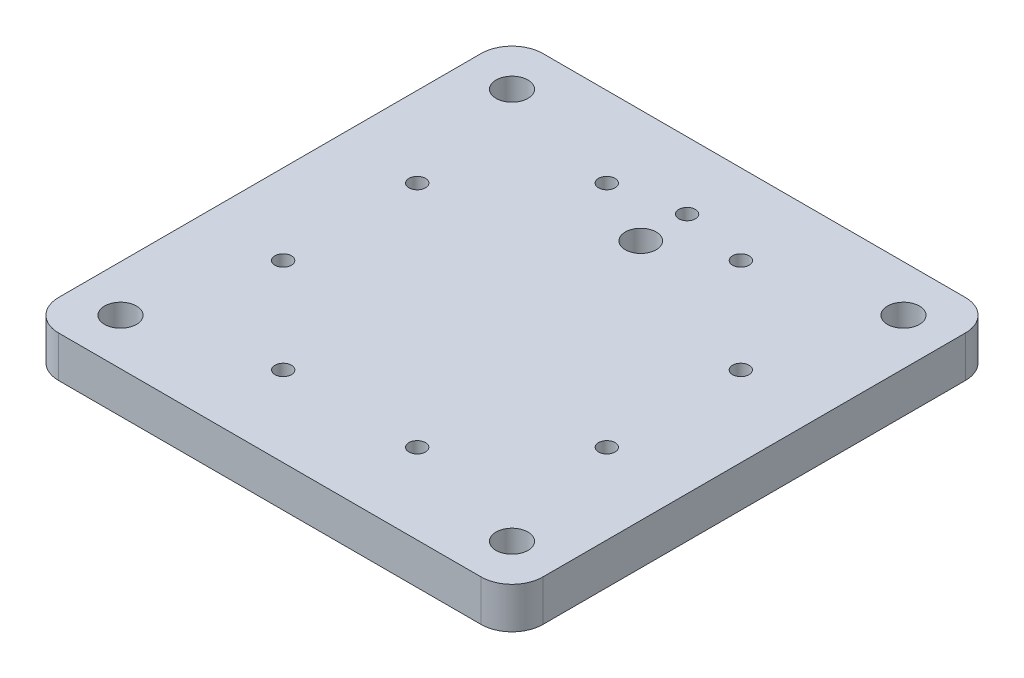
ISO-10303-21;
HEADER;
FILE_DESCRIPTION(('STEP AP214'),'2;1');
FILE_NAME('part.step','',(''),(''),'','','');
FILE_SCHEMA(('AUTOMOTIVE_DESIGN { 1 0 10303 214 1 1 1 1 }'));
ENDSEC;
DATA;
#1=APPLICATION_CONTEXT('core data for automotive mechanical design processes');
#2=APPLICATION_PROTOCOL_DEFINITION('international standard','automotive_design',2000,#1);
#3=PRODUCT_CONTEXT('',#1,'mechanical');
#4=PRODUCT('Part','Part','',(#3));
#5=PRODUCT_RELATED_PRODUCT_CATEGORY('part','',(#4));
#6=PRODUCT_DEFINITION_FORMATION('','',#4);
#7=PRODUCT_DEFINITION_CONTEXT('part definition',#1,'design');
#8=PRODUCT_DEFINITION('design','',#6,#7);
#9=PRODUCT_DEFINITION_SHAPE('','',#8);
#10=(LENGTH_UNIT() NAMED_UNIT(*) SI_UNIT(.MILLI.,.METRE.));
#11=(NAMED_UNIT(*) PLANE_ANGLE_UNIT() SI_UNIT($,.RADIAN.));
#12=(NAMED_UNIT(*) SI_UNIT($,.STERADIAN.) SOLID_ANGLE_UNIT());
#13=UNCERTAINTY_MEASURE_WITH_UNIT(LENGTH_MEASURE(1.E-05),#10,'distance_accuracy_value','');
#14=(GEOMETRIC_REPRESENTATION_CONTEXT(3) GLOBAL_UNCERTAINTY_ASSIGNED_CONTEXT((#13)) GLOBAL_UNIT_ASSIGNED_CONTEXT((#10,
#11,#12)) REPRESENTATION_CONTEXT('',''));
#15=CARTESIAN_POINT('',(0.,0.,0.));
#16=DIRECTION('',(0.,0.,1.));
#17=DIRECTION('',(1.,0.,0.));
#18=AXIS2_PLACEMENT_3D('',#15,#16,#17);
#19=CARTESIAN_POINT('',(-13.0112367004131,8.,-31.4119041053837));
#20=DIRECTION('',(0.,-1.,0.));
#21=DIRECTION('',(0.,0.,-1.));
#22=AXIS2_PLACEMENT_3D('',#19,#20,#21);
#23=CYLINDRICAL_SURFACE('',#22,1.6);
#24=CARTESIAN_POINT('',(-13.0112367004131,8.,-31.4119041053837));
#25=DIRECTION('',(0.,1.,0.));
#26=DIRECTION('',(0.,0.,1.));
#27=AXIS2_PLACEMENT_3D('',#24,#25,#26);
#28=CIRCLE('',#27,1.6);
#29=CARTESIAN_POINT('',(-13.0112367004131,8.,-29.8119041053837));
#30=VERTEX_POINT('',#29);
#31=EDGE_CURVE('E293',#30,#30,#28,.T.);
#32=ORIENTED_EDGE('',*,*,#31,.T.);
#33=EDGE_LOOP('',(#32));
#34=FACE_BOUND('',#33,.T.);
#35=CARTESIAN_POINT('',(-13.0112367004131,3.5,-31.4119041053837));
#36=DIRECTION('',(0.,-1.,0.));
#37=DIRECTION('',(0.,0.,-1.));
#38=AXIS2_PLACEMENT_3D('',#35,#36,#37);
#39=CIRCLE('',#38,1.6);
#40=CARTESIAN_POINT('',(-13.0112367004131,3.5,-33.0119041053837));
#41=VERTEX_POINT('',#40);
#42=EDGE_CURVE('E43',#41,#41,#39,.T.);
#43=ORIENTED_EDGE('',*,*,#42,.T.);
#44=EDGE_LOOP('',(#43));
#45=FACE_BOUND('',#44,.T.);
#46=ADVANCED_FACE('F39',(#34,#45),#23,.F.);
#47=CARTESIAN_POINT('',(13.0112367004135,8.,-31.411904105385));
#48=DIRECTION('',(0.,-1.,0.));
#49=DIRECTION('',(0.,0.,-1.));
#50=AXIS2_PLACEMENT_3D('',#47,#48,#49);
#51=CYLINDRICAL_SURFACE('',#50,1.6);
#52=CARTESIAN_POINT('',(13.0112367004135,8.,-31.411904105385));
#53=DIRECTION('',(0.,1.,0.));
#54=DIRECTION('',(0.,0.,1.));
#55=AXIS2_PLACEMENT_3D('',#52,#53,#54);
#56=CIRCLE('',#55,1.6);
#57=CARTESIAN_POINT('',(13.0112367004135,8.,-29.811904105385));
#58=VERTEX_POINT('',#57);
#59=EDGE_CURVE('E284',#58,#58,#56,.T.);
#60=ORIENTED_EDGE('',*,*,#59,.T.);
#61=EDGE_LOOP('',(#60));
#62=FACE_BOUND('',#61,.T.);
#63=CARTESIAN_POINT('',(13.0112367004135,3.5,-31.411904105385));
#64=DIRECTION('',(0.,-1.,0.));
#65=DIRECTION('',(0.,0.,-1.));
#66=AXIS2_PLACEMENT_3D('',#63,#64,#65);
#67=CIRCLE('',#66,1.6);
#68=CARTESIAN_POINT('',(13.0112367004135,3.5,-33.011904105385));
#69=VERTEX_POINT('',#68);
#70=EDGE_CURVE('E207',#69,#69,#67,.T.);
#71=ORIENTED_EDGE('',*,*,#70,.T.);
#72=EDGE_LOOP('',(#71));
#73=FACE_BOUND('',#72,.T.);
#74=ADVANCED_FACE('F335',(#62,#73),#51,.F.);
#75=CARTESIAN_POINT('',(31.4119041053854,8.,-13.0112367004148));
#76=DIRECTION('',(0.,-1.,0.));
#77=DIRECTION('',(0.,0.,-1.));
#78=AXIS2_PLACEMENT_3D('',#75,#76,#77);
#79=CYLINDRICAL_SURFACE('',#78,1.6);
#80=CARTESIAN_POINT('',(31.4119041053854,8.,-13.0112367004148));
#81=DIRECTION('',(0.,1.,0.));
#82=DIRECTION('',(0.,0.,1.));
#83=AXIS2_PLACEMENT_3D('',#80,#81,#82);
#84=CIRCLE('',#83,1.6);
#85=CARTESIAN_POINT('',(31.4119041053854,8.,-11.4112367004148));
#86=VERTEX_POINT('',#85);
#87=EDGE_CURVE('E280',#86,#86,#84,.T.);
#88=ORIENTED_EDGE('',*,*,#87,.T.);
#89=EDGE_LOOP('',(#88));
#90=FACE_BOUND('',#89,.T.);
#91=CARTESIAN_POINT('',(31.4119041053854,3.5,-13.0112367004148));
#92=DIRECTION('',(0.,-1.,0.));
#93=DIRECTION('',(0.,0.,-1.));
#94=AXIS2_PLACEMENT_3D('',#91,#92,#93);
#95=CIRCLE('',#94,1.6);
#96=CARTESIAN_POINT('',(31.4119041053854,3.5,-14.6112367004148));
#97=VERTEX_POINT('',#96);
#98=EDGE_CURVE('E204',#97,#97,#95,.T.);
#99=ORIENTED_EDGE('',*,*,#98,.T.);
#100=EDGE_LOOP('',(#99));
#101=FACE_BOUND('',#100,.T.);
#102=ADVANCED_FACE('F341',(#90,#101),#79,.F.);
#103=CARTESIAN_POINT('',(31.4119041053867,8.,13.0112367004118));
#104=DIRECTION('',(0.,-1.,0.));
#105=DIRECTION('',(0.,0.,-1.));
#106=AXIS2_PLACEMENT_3D('',#103,#104,#105);
#107=CYLINDRICAL_SURFACE('',#106,1.6);
#108=CARTESIAN_POINT('',(31.4119041053867,8.,13.0112367004118));
#109=DIRECTION('',(0.,1.,0.));
#110=DIRECTION('',(0.,0.,1.));
#111=AXIS2_PLACEMENT_3D('',#108,#109,#110);
#112=CIRCLE('',#111,1.6);
#113=CARTESIAN_POINT('',(31.4119041053867,8.,14.6112367004118));
#114=VERTEX_POINT('',#113);
#115=EDGE_CURVE('E276',#114,#114,#112,.T.);
#116=ORIENTED_EDGE('',*,*,#115,.T.);
#117=EDGE_LOOP('',(#116));
#118=FACE_BOUND('',#117,.T.);
#119=CARTESIAN_POINT('',(31.4119041053867,3.5,13.0112367004118));
#120=DIRECTION('',(0.,-1.,0.));
#121=DIRECTION('',(0.,0.,-1.));
#122=AXIS2_PLACEMENT_3D('',#119,#120,#121);
#123=CIRCLE('',#122,1.6);
#124=CARTESIAN_POINT('',(31.4119041053867,3.5,11.4112367004118));
#125=VERTEX_POINT('',#124);
#126=EDGE_CURVE('E200',#125,#125,#123,.T.);
#127=ORIENTED_EDGE('',*,*,#126,.T.);
#128=EDGE_LOOP('',(#127));
#129=FACE_BOUND('',#128,.T.);
#130=ADVANCED_FACE('F539',(#118,#129),#107,.F.);
#131=CARTESIAN_POINT('',(13.0112367004165,8.,31.4119041053837));
#132=DIRECTION('',(0.,-1.,0.));
#133=DIRECTION('',(0.,0.,-1.));
#134=AXIS2_PLACEMENT_3D('',#131,#132,#133);
#135=CYLINDRICAL_SURFACE('',#134,1.6);
#136=CARTESIAN_POINT('',(13.0112367004165,8.,31.4119041053837));
#137=DIRECTION('',(0.,1.,0.));
#138=DIRECTION('',(0.,0.,1.));
#139=AXIS2_PLACEMENT_3D('',#136,#137,#138);
#140=CIRCLE('',#139,1.6);
#141=CARTESIAN_POINT('',(13.0112367004165,8.,33.0119041053837));
#142=VERTEX_POINT('',#141);
#143=EDGE_CURVE('E272',#142,#142,#140,.T.);
#144=ORIENTED_EDGE('',*,*,#143,.T.);
#145=EDGE_LOOP('',(#144));
#146=FACE_BOUND('',#145,.T.);
#147=CARTESIAN_POINT('',(13.0112367004165,3.5,31.4119041053837));
#148=DIRECTION('',(0.,-1.,0.));
#149=DIRECTION('',(0.,0.,-1.));
#150=AXIS2_PLACEMENT_3D('',#147,#148,#149);
#151=CIRCLE('',#150,1.6);
#152=CARTESIAN_POINT('',(13.0112367004165,3.5,29.8119041053837));
#153=VERTEX_POINT('',#152);
#154=EDGE_CURVE('E196',#153,#153,#151,.T.);
#155=ORIENTED_EDGE('',*,*,#154,.T.);
#156=EDGE_LOOP('',(#155));
#157=FACE_BOUND('',#156,.T.);
#158=ADVANCED_FACE('F535',(#146,#157),#135,.F.);
#159=CARTESIAN_POINT('',(-13.0112367004101,8.,31.411904105385));
#160=DIRECTION('',(0.,-1.,0.));
#161=DIRECTION('',(0.,0.,-1.));
#162=AXIS2_PLACEMENT_3D('',#159,#160,#161);
#163=CYLINDRICAL_SURFACE('',#162,1.6);
#164=CARTESIAN_POINT('',(-13.0112367004101,8.,31.411904105385));
#165=DIRECTION('',(0.,1.,0.));
#166=DIRECTION('',(0.,0.,1.));
#167=AXIS2_PLACEMENT_3D('',#164,#165,#166);
#168=CIRCLE('',#167,1.6);
#169=CARTESIAN_POINT('',(-13.0112367004101,8.,33.011904105385));
#170=VERTEX_POINT('',#169);
#171=EDGE_CURVE('E268',#170,#170,#168,.T.);
#172=ORIENTED_EDGE('',*,*,#171,.T.);
#173=EDGE_LOOP('',(#172));
#174=FACE_BOUND('',#173,.T.);
#175=CARTESIAN_POINT('',(-13.0112367004101,3.5,31.411904105385));
#176=DIRECTION('',(0.,-1.,0.));
#177=DIRECTION('',(0.,0.,-1.));
#178=AXIS2_PLACEMENT_3D('',#175,#176,#177);
#179=CIRCLE('',#178,1.6);
#180=CARTESIAN_POINT('',(-13.0112367004101,3.5,29.811904105385));
#181=VERTEX_POINT('',#180);
#182=EDGE_CURVE('E192',#181,#181,#179,.T.);
#183=ORIENTED_EDGE('',*,*,#182,.T.);
#184=EDGE_LOOP('',(#183));
#185=FACE_BOUND('',#184,.T.);
#186=ADVANCED_FACE('F531',(#174,#185),#163,.F.);
#187=CARTESIAN_POINT('',(-31.411904105382,8.,13.0112367004148));
#188=DIRECTION('',(0.,-1.,0.));
#189=DIRECTION('',(0.,0.,-1.));
#190=AXIS2_PLACEMENT_3D('',#187,#188,#189);
#191=CYLINDRICAL_SURFACE('',#190,1.6);
#192=CARTESIAN_POINT('',(-31.411904105382,8.,13.0112367004148));
#193=DIRECTION('',(0.,1.,0.));
#194=DIRECTION('',(0.,0.,1.));
#195=AXIS2_PLACEMENT_3D('',#192,#193,#194);
#196=CIRCLE('',#195,1.6);
#197=CARTESIAN_POINT('',(-31.411904105382,8.,14.6112367004148));
#198=VERTEX_POINT('',#197);
#199=EDGE_CURVE('E264',#198,#198,#196,.T.);
#200=ORIENTED_EDGE('',*,*,#199,.T.);
#201=EDGE_LOOP('',(#200));
#202=FACE_BOUND('',#201,.T.);
#203=CARTESIAN_POINT('',(-31.411904105382,3.5,13.0112367004148));
#204=DIRECTION('',(0.,-1.,0.));
#205=DIRECTION('',(0.,0.,-1.));
#206=AXIS2_PLACEMENT_3D('',#203,#204,#205);
#207=CIRCLE('',#206,1.6);
#208=CARTESIAN_POINT('',(-31.411904105382,3.5,11.4112367004148));
#209=VERTEX_POINT('',#208);
#210=EDGE_CURVE('E187',#209,#209,#207,.T.);
#211=ORIENTED_EDGE('',*,*,#210,.T.);
#212=EDGE_LOOP('',(#211));
#213=FACE_BOUND('',#212,.T.);
#214=ADVANCED_FACE('F527',(#202,#213),#191,.F.);
#215=CARTESIAN_POINT('',(-31.4119041053833,8.,-13.0112367004118));
#216=DIRECTION('',(0.,-1.,0.));
#217=DIRECTION('',(0.,0.,-1.));
#218=AXIS2_PLACEMENT_3D('',#215,#216,#217);
#219=CYLINDRICAL_SURFACE('',#218,1.6);
#220=CARTESIAN_POINT('',(-31.4119041053833,8.,-13.0112367004118));
#221=DIRECTION('',(0.,1.,0.));
#222=DIRECTION('',(0.,0.,1.));
#223=AXIS2_PLACEMENT_3D('',#220,#221,#222);
#224=CIRCLE('',#223,1.6);
#225=CARTESIAN_POINT('',(-31.4119041053833,8.,-11.4112367004118));
#226=VERTEX_POINT('',#225);
#227=EDGE_CURVE('E257',#226,#226,#224,.T.);
#228=ORIENTED_EDGE('',*,*,#227,.T.);
#229=EDGE_LOOP('',(#228));
#230=FACE_BOUND('',#229,.T.);
#231=CARTESIAN_POINT('',(-31.4119041053833,3.5,-13.0112367004118));
#232=DIRECTION('',(0.,-1.,0.));
#233=DIRECTION('',(0.,0.,-1.));
#234=AXIS2_PLACEMENT_3D('',#231,#232,#233);
#235=CIRCLE('',#234,1.6);
#236=CARTESIAN_POINT('',(-31.4119041053833,3.5,-14.6112367004118));
#237=VERTEX_POINT('',#236);
#238=EDGE_CURVE('E183',#237,#237,#235,.T.);
#239=ORIENTED_EDGE('',*,*,#238,.T.);
#240=EDGE_LOOP('',(#239));
#241=FACE_BOUND('',#240,.T.);
#242=ADVANCED_FACE('F348',(#230,#241),#219,.F.);
#243=CARTESIAN_POINT('',(0.,8.,0.));
#244=DIRECTION('',(0.,1.,0.));
#245=DIRECTION('',(0.,0.,1.));
#246=AXIS2_PLACEMENT_3D('',#243,#244,#245);
#247=PLANE('',#246);
#248=CARTESIAN_POINT('',(38.,8.,38.));
#249=DIRECTION('',(0.,1.,0.));
#250=DIRECTION('',(0.,0.,1.));
#251=AXIS2_PLACEMENT_3D('',#248,#249,#250);
#252=CIRCLE('',#251,3.1000000000028);
#253=CARTESIAN_POINT('',(38.,8.,41.1000000000028));
#254=VERTEX_POINT('',#253);
#255=EDGE_CURVE('E229',#254,#254,#252,.T.);
#256=ORIENTED_EDGE('',*,*,#255,.F.);
#257=EDGE_LOOP('',(#256));
#258=FACE_BOUND('',#257,.T.);
#259=CARTESIAN_POINT('',(-38.,8.,-38.));
#260=DIRECTION('',(0.,1.,0.));
#261=DIRECTION('',(0.,0.,1.));
#262=AXIS2_PLACEMENT_3D('',#259,#260,#261);
#263=CIRCLE('',#262,3.09999999999999);
#264=CARTESIAN_POINT('',(-38.,8.,-34.9));
#265=VERTEX_POINT('',#264);
#266=EDGE_CURVE('E245',#265,#265,#263,.T.);
#267=ORIENTED_EDGE('',*,*,#266,.F.);
#268=EDGE_LOOP('',(#267));
#269=FACE_BOUND('',#268,.T.);
#270=ORIENTED_EDGE('',*,*,#227,.F.);
#271=EDGE_LOOP('',(#270));
#272=FACE_BOUND('',#271,.T.);
#273=ORIENTED_EDGE('',*,*,#171,.F.);
#274=EDGE_LOOP('',(#273));
#275=FACE_BOUND('',#274,.T.);
#276=ORIENTED_EDGE('',*,*,#115,.F.);
#277=EDGE_LOOP('',(#276));
#278=FACE_BOUND('',#277,.T.);
#279=ORIENTED_EDGE('',*,*,#59,.F.);
#280=EDGE_LOOP('',(#279));
#281=FACE_BOUND('',#280,.T.);
#282=ORIENTED_EDGE('',*,*,#31,.F.);
#283=EDGE_LOOP('',(#282));
#284=FACE_BOUND('',#283,.T.);
#285=DIRECTION('',(0.,0.,1.));
#286=VECTOR('',#285,1.);
#287=CARTESIAN_POINT('',(-47.,8.,-47.));
#288=LINE('',#287,#286);
#289=CARTESIAN_POINT('',(-47.,8.,-41.));
#290=VERTEX_POINT('',#289);
#291=CARTESIAN_POINT('',(-47.,8.,41.));
#292=VERTEX_POINT('',#291);
#293=EDGE_CURVE('E303',#290,#292,#288,.T.);
#294=ORIENTED_EDGE('',*,*,#293,.T.);
#295=CARTESIAN_POINT('',(-41.,8.,41.));
#296=DIRECTION('',(0.,1.,0.));
#297=DIRECTION('',(0.,0.,1.));
#298=AXIS2_PLACEMENT_3D('',#295,#296,#297);
#299=CIRCLE('',#298,6.);
#300=CARTESIAN_POINT('',(-41.,8.,47.));
#301=VERTEX_POINT('',#300);
#302=EDGE_CURVE('E172',#292,#301,#299,.T.);
#303=ORIENTED_EDGE('',*,*,#302,.T.);
#304=DIRECTION('',(1.,0.,0.));
#305=VECTOR('',#304,1.);
#306=CARTESIAN_POINT('',(-47.,8.,47.));
#307=LINE('',#306,#305);
#308=CARTESIAN_POINT('',(41.,8.,47.));
#309=VERTEX_POINT('',#308);
#310=EDGE_CURVE('E130',#301,#309,#307,.T.);
#311=ORIENTED_EDGE('',*,*,#310,.T.);
#312=CARTESIAN_POINT('',(41.,8.,41.));
#313=DIRECTION('',(0.,1.,0.));
#314=DIRECTION('',(0.,0.,1.));
#315=AXIS2_PLACEMENT_3D('',#312,#313,#314);
#316=CIRCLE('',#315,6.);
#317=CARTESIAN_POINT('',(47.,8.,41.));
#318=VERTEX_POINT('',#317);
#319=EDGE_CURVE('E166',#309,#318,#316,.T.);
#320=ORIENTED_EDGE('',*,*,#319,.T.);
#321=DIRECTION('',(0.,0.,-1.));
#322=VECTOR('',#321,1.);
#323=CARTESIAN_POINT('',(47.,8.,-47.));
#324=LINE('',#323,#322);
#325=CARTESIAN_POINT('',(47.,8.,-41.));
#326=VERTEX_POINT('',#325);
#327=EDGE_CURVE('E140',#318,#326,#324,.T.);
#328=ORIENTED_EDGE('',*,*,#327,.T.);
#329=CARTESIAN_POINT('',(41.,8.,-41.));
#330=DIRECTION('',(0.,1.,0.));
#331=DIRECTION('',(0.,0.,1.));
#332=AXIS2_PLACEMENT_3D('',#329,#330,#331);
#333=CIRCLE('',#332,6.);
#334=CARTESIAN_POINT('',(41.,8.,-47.));
#335=VERTEX_POINT('',#334);
#336=EDGE_CURVE('E64',#326,#335,#333,.T.);
#337=ORIENTED_EDGE('',*,*,#336,.T.);
#338=DIRECTION('',(-1.,0.,0.));
#339=VECTOR('',#338,1.);
#340=CARTESIAN_POINT('',(-47.,8.,-47.));
#341=LINE('',#340,#339);
#342=CARTESIAN_POINT('',(-41.,8.,-47.));
#343=VERTEX_POINT('',#342);
#344=EDGE_CURVE('E145',#335,#343,#341,.T.);
#345=ORIENTED_EDGE('',*,*,#344,.T.);
#346=CARTESIAN_POINT('',(-41.,8.,-41.));
#347=DIRECTION('',(0.,1.,0.));
#348=DIRECTION('',(0.,0.,1.));
#349=AXIS2_PLACEMENT_3D('',#346,#347,#348);
#350=CIRCLE('',#349,6.);
#351=EDGE_CURVE('E169',#343,#290,#350,.T.);
#352=ORIENTED_EDGE('',*,*,#351,.T.);
#353=EDGE_LOOP('',(#294,#303,#311,#320,#328,#337,#345,#352));
#354=FACE_BOUND('',#353,.T.);
#355=CARTESIAN_POINT('',(0.,8.,-34.));
#356=DIRECTION('',(0.,1.,0.));
#357=DIRECTION('',(0.,0.,1.));
#358=AXIS2_PLACEMENT_3D('',#355,#356,#357);
#359=CIRCLE('',#358,1.6);
#360=CARTESIAN_POINT('',(0.,8.,-32.4));
#361=VERTEX_POINT('',#360);
#362=EDGE_CURVE('E289',#361,#361,#359,.T.);
#363=ORIENTED_EDGE('',*,*,#362,.F.);
#364=EDGE_LOOP('',(#363));
#365=FACE_BOUND('',#364,.T.);
#366=ORIENTED_EDGE('',*,*,#87,.F.);
#367=EDGE_LOOP('',(#366));
#368=FACE_BOUND('',#367,.T.);
#369=ORIENTED_EDGE('',*,*,#143,.F.);
#370=EDGE_LOOP('',(#369));
#371=FACE_BOUND('',#370,.T.);
#372=ORIENTED_EDGE('',*,*,#199,.F.);
#373=EDGE_LOOP('',(#372));
#374=FACE_BOUND('',#373,.T.);
#375=CARTESIAN_POINT('',(0.,8.,-25.));
#376=DIRECTION('',(0.,1.,0.));
#377=DIRECTION('',(0.,0.,1.));
#378=AXIS2_PLACEMENT_3D('',#375,#376,#377);
#379=CIRCLE('',#378,3.);
#380=CARTESIAN_POINT('',(0.,8.,-22.));
#381=VERTEX_POINT('',#380);
#382=EDGE_CURVE('E253',#381,#381,#379,.T.);
#383=ORIENTED_EDGE('',*,*,#382,.F.);
#384=EDGE_LOOP('',(#383));
#385=FACE_BOUND('',#384,.T.);
#386=CARTESIAN_POINT('',(38.,8.,-38.));
#387=DIRECTION('',(0.,1.,0.));
#388=DIRECTION('',(0.,0.,1.));
#389=AXIS2_PLACEMENT_3D('',#386,#387,#388);
#390=CIRCLE('',#389,3.10000000000066);
#391=CARTESIAN_POINT('',(38.,8.,-34.8999999999993));
#392=VERTEX_POINT('',#391);
#393=EDGE_CURVE('E237',#392,#392,#390,.T.);
#394=ORIENTED_EDGE('',*,*,#393,.F.);
#395=EDGE_LOOP('',(#394));
#396=FACE_BOUND('',#395,.T.);
#397=CARTESIAN_POINT('',(-38.,8.,38.));
#398=DIRECTION('',(0.,1.,0.));
#399=DIRECTION('',(0.,0.,1.));
#400=AXIS2_PLACEMENT_3D('',#397,#398,#399);
#401=CIRCLE('',#400,3.10000000000214);
#402=CARTESIAN_POINT('',(-38.,8.,41.1000000000021));
#403=VERTEX_POINT('',#402);
#404=EDGE_CURVE('E219',#403,#403,#401,.T.);
#405=ORIENTED_EDGE('',*,*,#404,.F.);
#406=EDGE_LOOP('',(#405));
#407=FACE_BOUND('',#406,.T.);
#408=ADVANCED_FACE('F320',(#258,#269,#272,#275,#278,#281,#284,#354,#365,#368,#371,#374,#385,
#396,#407),#247,.T.);
#409=CARTESIAN_POINT('',(0.,0.,0.));
#410=DIRECTION('',(0.,1.,0.));
#411=DIRECTION('',(0.,0.,1.));
#412=AXIS2_PLACEMENT_3D('',#409,#410,#411);
#413=PLANE('',#412);
#414=CARTESIAN_POINT('',(-31.4119041053838,0.,-13.011236700413));
#415=DIRECTION('',(0.,-1.,0.));
#416=DIRECTION('',(0.,0.,-1.));
#417=AXIS2_PLACEMENT_3D('',#414,#415,#416);
#418=CIRCLE('',#417,4.1);
#419=CARTESIAN_POINT('',(-31.4119041053838,0.,-17.111236700413));
#420=VERTEX_POINT('',#419);
#421=EDGE_CURVE('E360',#420,#420,#418,.T.);
#422=ORIENTED_EDGE('',*,*,#421,.F.);
#423=EDGE_LOOP('',(#422));
#424=FACE_BOUND('',#423,.T.);
#425=CARTESIAN_POINT('',(-31.4119041053837,0.,13.0112367004131));
#426=DIRECTION('',(0.,-1.,0.));
#427=DIRECTION('',(0.,0.,-1.));
#428=AXIS2_PLACEMENT_3D('',#425,#426,#427);
#429=CIRCLE('',#428,4.1);
#430=CARTESIAN_POINT('',(-31.4119041053837,0.,8.91123670041308));
#431=VERTEX_POINT('',#430);
#432=EDGE_CURVE('E364',#431,#431,#429,.T.);
#433=ORIENTED_EDGE('',*,*,#432,.F.);
#434=EDGE_LOOP('',(#433));
#435=FACE_BOUND('',#434,.T.);
#436=CARTESIAN_POINT('',(-13.011236700413,0.,31.4119041053838));
#437=DIRECTION('',(0.,-1.,0.));
#438=DIRECTION('',(0.,0.,-1.));
#439=AXIS2_PLACEMENT_3D('',#436,#437,#438);
#440=CIRCLE('',#439,4.1);
#441=CARTESIAN_POINT('',(-13.011236700413,0.,27.3119041053838));
#442=VERTEX_POINT('',#441);
#443=EDGE_CURVE('E368',#442,#442,#440,.T.);
#444=ORIENTED_EDGE('',*,*,#443,.F.);
#445=EDGE_LOOP('',(#444));
#446=FACE_BOUND('',#445,.T.);
#447=CARTESIAN_POINT('',(13.0112367004131,0.,31.4119041053837));
#448=DIRECTION('',(0.,-1.,0.));
#449=DIRECTION('',(0.,0.,-1.));
#450=AXIS2_PLACEMENT_3D('',#447,#448,#449);
#451=CIRCLE('',#450,4.1);
#452=CARTESIAN_POINT('',(13.0112367004131,0.,27.3119041053837));
#453=VERTEX_POINT('',#452);
#454=EDGE_CURVE('E372',#453,#453,#451,.T.);
#455=ORIENTED_EDGE('',*,*,#454,.F.);
#456=EDGE_LOOP('',(#455));
#457=FACE_BOUND('',#456,.T.);
#458=CARTESIAN_POINT('',(31.4119041053838,0.,13.011236700413));
#459=DIRECTION('',(0.,-1.,0.));
#460=DIRECTION('',(0.,0.,-1.));
#461=AXIS2_PLACEMENT_3D('',#458,#459,#460);
#462=CIRCLE('',#461,4.1);
#463=CARTESIAN_POINT('',(31.4119041053838,0.,8.91123670041303));
#464=VERTEX_POINT('',#463);
#465=EDGE_CURVE('E376',#464,#464,#462,.T.);
#466=ORIENTED_EDGE('',*,*,#465,.F.);
#467=EDGE_LOOP('',(#466));
#468=FACE_BOUND('',#467,.T.);
#469=CARTESIAN_POINT('',(31.4119041053837,0.,-13.0112367004131));
#470=DIRECTION('',(0.,-1.,0.));
#471=DIRECTION('',(0.,0.,-1.));
#472=AXIS2_PLACEMENT_3D('',#469,#470,#471);
#473=CIRCLE('',#472,4.1);
#474=CARTESIAN_POINT('',(31.4119041053837,0.,-17.1112367004131));
#475=VERTEX_POINT('',#474);
#476=EDGE_CURVE('E380',#475,#475,#473,.T.);
#477=ORIENTED_EDGE('',*,*,#476,.F.);
#478=EDGE_LOOP('',(#477));
#479=FACE_BOUND('',#478,.T.);
#480=CARTESIAN_POINT('',(13.011236700413,0.,-31.4119041053838));
#481=DIRECTION('',(0.,-1.,0.));
#482=DIRECTION('',(0.,0.,-1.));
#483=AXIS2_PLACEMENT_3D('',#480,#481,#482);
#484=CIRCLE('',#483,4.1);
#485=CARTESIAN_POINT('',(13.011236700413,0.,-35.5119041053838));
#486=VERTEX_POINT('',#485);
#487=EDGE_CURVE('E384',#486,#486,#484,.T.);
#488=ORIENTED_EDGE('',*,*,#487,.F.);
#489=EDGE_LOOP('',(#488));
#490=FACE_BOUND('',#489,.T.);
#491=CARTESIAN_POINT('',(-13.0112367004131,0.,-31.4119041053837));
#492=DIRECTION('',(0.,-1.,0.));
#493=DIRECTION('',(0.,0.,-1.));
#494=AXIS2_PLACEMENT_3D('',#491,#492,#493);
#495=CIRCLE('',#494,4.1);
#496=CARTESIAN_POINT('',(-13.0112367004131,0.,-35.5119041053837));
#497=VERTEX_POINT('',#496);
#498=EDGE_CURVE('E387',#497,#497,#495,.T.);
#499=ORIENTED_EDGE('',*,*,#498,.F.);
#500=EDGE_LOOP('',(#499));
#501=FACE_BOUND('',#500,.T.);
#502=DIRECTION('',(1.,0.,0.));
#503=VECTOR('',#502,1.);
#504=CARTESIAN_POINT('',(-47.,0.,47.));
#505=LINE('',#504,#503);
#506=CARTESIAN_POINT('',(-41.,0.,47.));
#507=VERTEX_POINT('',#506);
#508=CARTESIAN_POINT('',(41.,0.,47.));
#509=VERTEX_POINT('',#508);
#510=EDGE_CURVE('E127',#507,#509,#505,.T.);
#511=ORIENTED_EDGE('',*,*,#510,.F.);
#512=CARTESIAN_POINT('',(-41.,0.,41.));
#513=DIRECTION('',(0.,1.,0.));
#514=DIRECTION('',(0.,0.,1.));
#515=AXIS2_PLACEMENT_3D('',#512,#513,#514);
#516=CIRCLE('',#515,6.);
#517=CARTESIAN_POINT('',(-47.,0.,41.));
#518=VERTEX_POINT('',#517);
#519=EDGE_CURVE('E109',#507,#518,#516,.F.);
#520=ORIENTED_EDGE('',*,*,#519,.T.);
#521=DIRECTION('',(0.,0.,1.));
#522=VECTOR('',#521,1.);
#523=CARTESIAN_POINT('',(-47.,0.,-47.));
#524=LINE('',#523,#522);
#525=CARTESIAN_POINT('',(-47.,0.,-41.));
#526=VERTEX_POINT('',#525);
#527=EDGE_CURVE('E141',#526,#518,#524,.T.);
#528=ORIENTED_EDGE('',*,*,#527,.F.);
#529=CARTESIAN_POINT('',(-41.,0.,-41.));
#530=DIRECTION('',(0.,1.,0.));
#531=DIRECTION('',(0.,0.,1.));
#532=AXIS2_PLACEMENT_3D('',#529,#530,#531);
#533=CIRCLE('',#532,6.);
#534=CARTESIAN_POINT('',(-41.,0.,-47.));
#535=VERTEX_POINT('',#534);
#536=EDGE_CURVE('E121',#526,#535,#533,.F.);
#537=ORIENTED_EDGE('',*,*,#536,.T.);
#538=DIRECTION('',(-1.,0.,0.));
#539=VECTOR('',#538,1.);
#540=CARTESIAN_POINT('',(-47.,0.,-47.));
#541=LINE('',#540,#539);
#542=CARTESIAN_POINT('',(41.,0.,-47.));
#543=VERTEX_POINT('',#542);
#544=EDGE_CURVE('E147',#543,#535,#541,.T.);
#545=ORIENTED_EDGE('',*,*,#544,.F.);
#546=CARTESIAN_POINT('',(41.,0.,-41.));
#547=DIRECTION('',(0.,1.,0.));
#548=DIRECTION('',(0.,0.,1.));
#549=AXIS2_PLACEMENT_3D('',#546,#547,#548);
#550=CIRCLE('',#549,6.);
#551=CARTESIAN_POINT('',(47.,0.,-41.));
#552=VERTEX_POINT('',#551);
#553=EDGE_CURVE('E132',#543,#552,#550,.F.);
#554=ORIENTED_EDGE('',*,*,#553,.T.);
#555=DIRECTION('',(0.,0.,-1.));
#556=VECTOR('',#555,1.);
#557=CARTESIAN_POINT('',(47.,0.,-47.));
#558=LINE('',#557,#556);
#559=CARTESIAN_POINT('',(47.,0.,41.));
#560=VERTEX_POINT('',#559);
#561=EDGE_CURVE('E299',#560,#552,#558,.T.);
#562=ORIENTED_EDGE('',*,*,#561,.F.);
#563=CARTESIAN_POINT('',(41.,0.,41.));
#564=DIRECTION('',(0.,1.,0.));
#565=DIRECTION('',(0.,0.,1.));
#566=AXIS2_PLACEMENT_3D('',#563,#564,#565);
#567=CIRCLE('',#566,6.);
#568=EDGE_CURVE('E138',#560,#509,#567,.F.);
#569=ORIENTED_EDGE('',*,*,#568,.T.);
#570=EDGE_LOOP('',(#511,#520,#528,#537,#545,#554,#562,#569));
#571=FACE_BOUND('',#570,.T.);
#572=CARTESIAN_POINT('',(0.,0.,-34.));
#573=DIRECTION('',(0.,1.,0.));
#574=DIRECTION('',(0.,0.,1.));
#575=AXIS2_PLACEMENT_3D('',#572,#573,#574);
#576=CIRCLE('',#575,1.6);
#577=CARTESIAN_POINT('',(0.,0.,-32.4));
#578=VERTEX_POINT('',#577);
#579=EDGE_CURVE('E288',#578,#578,#576,.T.);
#580=ORIENTED_EDGE('',*,*,#579,.T.);
#581=EDGE_LOOP('',(#580));
#582=FACE_BOUND('',#581,.T.);
#583=CARTESIAN_POINT('',(0.,0.,-25.));
#584=DIRECTION('',(0.,1.,0.));
#585=DIRECTION('',(0.,0.,1.));
#586=AXIS2_PLACEMENT_3D('',#583,#584,#585);
#587=CIRCLE('',#586,3.);
#588=CARTESIAN_POINT('',(0.,0.,-22.));
#589=VERTEX_POINT('',#588);
#590=EDGE_CURVE('E249',#589,#589,#587,.T.);
#591=ORIENTED_EDGE('',*,*,#590,.T.);
#592=EDGE_LOOP('',(#591));
#593=FACE_BOUND('',#592,.T.);
#594=CARTESIAN_POINT('',(-38.,0.,-38.));
#595=DIRECTION('',(0.,1.,0.));
#596=DIRECTION('',(0.,0.,1.));
#597=AXIS2_PLACEMENT_3D('',#594,#595,#596);
#598=CIRCLE('',#597,3.09999999999999);
#599=CARTESIAN_POINT('',(-38.,0.,-34.9));
#600=VERTEX_POINT('',#599);
#601=EDGE_CURVE('E241',#600,#600,#598,.T.);
#602=ORIENTED_EDGE('',*,*,#601,.T.);
#603=EDGE_LOOP('',(#602));
#604=FACE_BOUND('',#603,.T.);
#605=CARTESIAN_POINT('',(38.,0.,-38.));
#606=DIRECTION('',(0.,1.,0.));
#607=DIRECTION('',(0.,0.,1.));
#608=AXIS2_PLACEMENT_3D('',#605,#606,#607);
#609=CIRCLE('',#608,3.10000000000066);
#610=CARTESIAN_POINT('',(38.,0.,-34.8999999999993));
#611=VERTEX_POINT('',#610);
#612=EDGE_CURVE('E233',#611,#611,#609,.T.);
#613=ORIENTED_EDGE('',*,*,#612,.T.);
#614=EDGE_LOOP('',(#613));
#615=FACE_BOUND('',#614,.T.);
#616=CARTESIAN_POINT('',(38.,0.,38.));
#617=DIRECTION('',(0.,1.,0.));
#618=DIRECTION('',(0.,0.,1.));
#619=AXIS2_PLACEMENT_3D('',#616,#617,#618);
#620=CIRCLE('',#619,3.1000000000028);
#621=CARTESIAN_POINT('',(38.,0.,41.1000000000028));
#622=VERTEX_POINT('',#621);
#623=EDGE_CURVE('E225',#622,#622,#620,.T.);
#624=ORIENTED_EDGE('',*,*,#623,.T.);
#625=EDGE_LOOP('',(#624));
#626=FACE_BOUND('',#625,.T.);
#627=CARTESIAN_POINT('',(-38.,0.,38.));
#628=DIRECTION('',(0.,1.,0.));
#629=DIRECTION('',(0.,0.,1.));
#630=AXIS2_PLACEMENT_3D('',#627,#628,#629);
#631=CIRCLE('',#630,3.10000000000214);
#632=CARTESIAN_POINT('',(-38.,0.,41.1000000000021));
#633=VERTEX_POINT('',#632);
#634=EDGE_CURVE('E214',#633,#633,#631,.T.);
#635=ORIENTED_EDGE('',*,*,#634,.T.);
#636=EDGE_LOOP('',(#635));
#637=FACE_BOUND('',#636,.T.);
#638=ADVANCED_FACE('F135',(#424,#435,#446,#457,#468,#479,#490,#501,#571,#582,#593,#604,#615,
#626,#637),#413,.F.);
#639=CARTESIAN_POINT('',(47.,8.,-47.));
#640=DIRECTION('',(-1.,0.,0.));
#641=DIRECTION('',(0.,0.,1.));
#642=AXIS2_PLACEMENT_3D('',#639,#640,#641);
#643=PLANE('',#642);
#644=ORIENTED_EDGE('',*,*,#327,.F.);
#645=DIRECTION('',(0.,-1.,0.));
#646=VECTOR('',#645,1.);
#647=CARTESIAN_POINT('',(47.,8.,41.));
#648=LINE('',#647,#646);
#649=EDGE_CURVE('E11',#318,#560,#648,.T.);
#650=ORIENTED_EDGE('',*,*,#649,.T.);
#651=ORIENTED_EDGE('',*,*,#561,.T.);
#652=DIRECTION('',(0.,-1.,0.));
#653=VECTOR('',#652,1.);
#654=CARTESIAN_POINT('',(47.,8.,-41.));
#655=LINE('',#654,#653);
#656=EDGE_CURVE('E49',#552,#326,#655,.F.);
#657=ORIENTED_EDGE('',*,*,#656,.T.);
#658=EDGE_LOOP('',(#644,#650,#651,#657));
#659=FACE_BOUND('',#658,.T.);
#660=ADVANCED_FACE('F332',(#659),#643,.F.);
#661=CARTESIAN_POINT('',(-47.,8.,-47.));
#662=DIRECTION('',(0.,0.,1.));
#663=DIRECTION('',(1.,0.,0.));
#664=AXIS2_PLACEMENT_3D('',#661,#662,#663);
#665=PLANE('',#664);
#666=ORIENTED_EDGE('',*,*,#544,.T.);
#667=DIRECTION('',(0.,-1.,0.));
#668=VECTOR('',#667,1.);
#669=CARTESIAN_POINT('',(-41.,8.,-47.));
#670=LINE('',#669,#668);
#671=EDGE_CURVE('E57',#535,#343,#670,.F.);
#672=ORIENTED_EDGE('',*,*,#671,.T.);
#673=ORIENTED_EDGE('',*,*,#344,.F.);
#674=DIRECTION('',(0.,-1.,0.));
#675=VECTOR('',#674,1.);
#676=CARTESIAN_POINT('',(41.,8.,-47.));
#677=LINE('',#676,#675);
#678=EDGE_CURVE('E175',#335,#543,#677,.T.);
#679=ORIENTED_EDGE('',*,*,#678,.T.);
#680=EDGE_LOOP('',(#666,#672,#673,#679));
#681=FACE_BOUND('',#680,.T.);
#682=ADVANCED_FACE('F313',(#681),#665,.F.);
#683=CARTESIAN_POINT('',(-47.,8.,-47.));
#684=DIRECTION('',(1.,0.,0.));
#685=DIRECTION('',(0.,0.,-1.));
#686=AXIS2_PLACEMENT_3D('',#683,#684,#685);
#687=PLANE('',#686);
#688=ORIENTED_EDGE('',*,*,#527,.T.);
#689=DIRECTION('',(0.,-1.,0.));
#690=VECTOR('',#689,1.);
#691=CARTESIAN_POINT('',(-47.,8.,41.));
#692=LINE('',#691,#690);
#693=EDGE_CURVE('E114',#518,#292,#692,.F.);
#694=ORIENTED_EDGE('',*,*,#693,.T.);
#695=ORIENTED_EDGE('',*,*,#293,.F.);
#696=DIRECTION('',(0.,-1.,0.));
#697=VECTOR('',#696,1.);
#698=CARTESIAN_POINT('',(-47.,8.,-41.));
#699=LINE('',#698,#697);
#700=EDGE_CURVE('E120',#290,#526,#699,.T.);
#701=ORIENTED_EDGE('',*,*,#700,.T.);
#702=EDGE_LOOP('',(#688,#694,#695,#701));
#703=FACE_BOUND('',#702,.T.);
#704=ADVANCED_FACE('F323',(#703),#687,.F.);
#705=CARTESIAN_POINT('',(-47.,8.,47.));
#706=DIRECTION('',(0.,0.,-1.));
#707=DIRECTION('',(-1.,0.,0.));
#708=AXIS2_PLACEMENT_3D('',#705,#706,#707);
#709=PLANE('',#708);
#710=ORIENTED_EDGE('',*,*,#310,.F.);
#711=DIRECTION('',(0.,-1.,0.));
#712=VECTOR('',#711,1.);
#713=CARTESIAN_POINT('',(-41.,8.,47.));
#714=LINE('',#713,#712);
#715=EDGE_CURVE('E113',#301,#507,#714,.T.);
#716=ORIENTED_EDGE('',*,*,#715,.T.);
#717=ORIENTED_EDGE('',*,*,#510,.T.);
#718=DIRECTION('',(0.,-1.,0.));
#719=VECTOR('',#718,1.);
#720=CARTESIAN_POINT('',(41.,8.,47.));
#721=LINE('',#720,#719);
#722=EDGE_CURVE('E133',#509,#309,#721,.F.);
#723=ORIENTED_EDGE('',*,*,#722,.T.);
#724=EDGE_LOOP('',(#710,#716,#717,#723));
#725=FACE_BOUND('',#724,.T.);
#726=ADVANCED_FACE('F126',(#725),#709,.F.);
#727=CARTESIAN_POINT('',(0.,8.,-34.));
#728=DIRECTION('',(0.,-1.,0.));
#729=DIRECTION('',(0.,0.,-1.));
#730=AXIS2_PLACEMENT_3D('',#727,#728,#729);
#731=CYLINDRICAL_SURFACE('',#730,1.6);
#732=ORIENTED_EDGE('',*,*,#362,.T.);
#733=EDGE_LOOP('',(#732));
#734=FACE_BOUND('',#733,.T.);
#735=ORIENTED_EDGE('',*,*,#579,.F.);
#736=EDGE_LOOP('',(#735));
#737=FACE_BOUND('',#736,.T.);
#738=ADVANCED_FACE('F330',(#734,#737),#731,.F.);
#739=CARTESIAN_POINT('',(0.,8.,-25.));
#740=DIRECTION('',(0.,-1.,0.));
#741=DIRECTION('',(0.,0.,-1.));
#742=AXIS2_PLACEMENT_3D('',#739,#740,#741);
#743=CYLINDRICAL_SURFACE('',#742,3.);
#744=ORIENTED_EDGE('',*,*,#382,.T.);
#745=EDGE_LOOP('',(#744));
#746=FACE_BOUND('',#745,.T.);
#747=ORIENTED_EDGE('',*,*,#590,.F.);
#748=EDGE_LOOP('',(#747));
#749=FACE_BOUND('',#748,.T.);
#750=ADVANCED_FACE('F520',(#746,#749),#743,.F.);
#751=CARTESIAN_POINT('',(-38.,8.,-38.));
#752=DIRECTION('',(0.,-1.,0.));
#753=DIRECTION('',(0.,0.,-1.));
#754=AXIS2_PLACEMENT_3D('',#751,#752,#753);
#755=CYLINDRICAL_SURFACE('',#754,3.09999999999999);
#756=ORIENTED_EDGE('',*,*,#266,.T.);
#757=EDGE_LOOP('',(#756));
#758=FACE_BOUND('',#757,.T.);
#759=ORIENTED_EDGE('',*,*,#601,.F.);
#760=EDGE_LOOP('',(#759));
#761=FACE_BOUND('',#760,.T.);
#762=ADVANCED_FACE('F516',(#758,#761),#755,.F.);
#763=CARTESIAN_POINT('',(38.,8.,-38.));
#764=DIRECTION('',(0.,-1.,0.));
#765=DIRECTION('',(0.,0.,-1.));
#766=AXIS2_PLACEMENT_3D('',#763,#764,#765);
#767=CYLINDRICAL_SURFACE('',#766,3.10000000000066);
#768=ORIENTED_EDGE('',*,*,#393,.T.);
#769=EDGE_LOOP('',(#768));
#770=FACE_BOUND('',#769,.T.);
#771=ORIENTED_EDGE('',*,*,#612,.F.);
#772=EDGE_LOOP('',(#771));
#773=FACE_BOUND('',#772,.T.);
#774=ADVANCED_FACE('F512',(#770,#773),#767,.F.);
#775=CARTESIAN_POINT('',(38.,8.,38.));
#776=DIRECTION('',(0.,-1.,0.));
#777=DIRECTION('',(0.,0.,-1.));
#778=AXIS2_PLACEMENT_3D('',#775,#776,#777);
#779=CYLINDRICAL_SURFACE('',#778,3.1000000000028);
#780=ORIENTED_EDGE('',*,*,#255,.T.);
#781=EDGE_LOOP('',(#780));
#782=FACE_BOUND('',#781,.T.);
#783=ORIENTED_EDGE('',*,*,#623,.F.);
#784=EDGE_LOOP('',(#783));
#785=FACE_BOUND('',#784,.T.);
#786=ADVANCED_FACE('F508',(#782,#785),#779,.F.);
#787=CARTESIAN_POINT('',(-38.,8.,38.));
#788=DIRECTION('',(0.,-1.,0.));
#789=DIRECTION('',(0.,0.,-1.));
#790=AXIS2_PLACEMENT_3D('',#787,#788,#789);
#791=CYLINDRICAL_SURFACE('',#790,3.10000000000214);
#792=ORIENTED_EDGE('',*,*,#404,.T.);
#793=EDGE_LOOP('',(#792));
#794=FACE_BOUND('',#793,.T.);
#795=ORIENTED_EDGE('',*,*,#634,.F.);
#796=EDGE_LOOP('',(#795));
#797=FACE_BOUND('',#796,.T.);
#798=ADVANCED_FACE('F505',(#794,#797),#791,.F.);
#799=CARTESIAN_POINT('',(-41.,8.,41.));
#800=DIRECTION('',(0.,-1.,0.));
#801=DIRECTION('',(0.,0.,-1.));
#802=AXIS2_PLACEMENT_3D('',#799,#800,#801);
#803=CYLINDRICAL_SURFACE('',#802,6.);
#804=ORIENTED_EDGE('',*,*,#302,.F.);
#805=ORIENTED_EDGE('',*,*,#693,.F.);
#806=ORIENTED_EDGE('',*,*,#519,.F.);
#807=ORIENTED_EDGE('',*,*,#715,.F.);
#808=EDGE_LOOP('',(#804,#805,#806,#807));
#809=FACE_BOUND('',#808,.T.);
#810=ADVANCED_FACE('F112',(#809),#803,.T.);
#811=CARTESIAN_POINT('',(-41.,8.,-41.));
#812=DIRECTION('',(0.,-1.,0.));
#813=DIRECTION('',(0.,0.,-1.));
#814=AXIS2_PLACEMENT_3D('',#811,#812,#813);
#815=CYLINDRICAL_SURFACE('',#814,6.);
#816=ORIENTED_EDGE('',*,*,#351,.F.);
#817=ORIENTED_EDGE('',*,*,#671,.F.);
#818=ORIENTED_EDGE('',*,*,#536,.F.);
#819=ORIENTED_EDGE('',*,*,#700,.F.);
#820=EDGE_LOOP('',(#816,#817,#818,#819));
#821=FACE_BOUND('',#820,.T.);
#822=ADVANCED_FACE('F317',(#821),#815,.T.);
#823=CARTESIAN_POINT('',(41.,8.,41.));
#824=DIRECTION('',(0.,-1.,0.));
#825=DIRECTION('',(0.,0.,-1.));
#826=AXIS2_PLACEMENT_3D('',#823,#824,#825);
#827=CYLINDRICAL_SURFACE('',#826,6.);
#828=ORIENTED_EDGE('',*,*,#319,.F.);
#829=ORIENTED_EDGE('',*,*,#722,.F.);
#830=ORIENTED_EDGE('',*,*,#568,.F.);
#831=ORIENTED_EDGE('',*,*,#649,.F.);
#832=EDGE_LOOP('',(#828,#829,#830,#831));
#833=FACE_BOUND('',#832,.T.);
#834=ADVANCED_FACE('F660',(#833),#827,.T.);
#835=CARTESIAN_POINT('',(41.,8.,-41.));
#836=DIRECTION('',(0.,-1.,0.));
#837=DIRECTION('',(0.,0.,-1.));
#838=AXIS2_PLACEMENT_3D('',#835,#836,#837);
#839=CYLINDRICAL_SURFACE('',#838,6.);
#840=ORIENTED_EDGE('',*,*,#336,.F.);
#841=ORIENTED_EDGE('',*,*,#656,.F.);
#842=ORIENTED_EDGE('',*,*,#553,.F.);
#843=ORIENTED_EDGE('',*,*,#678,.F.);
#844=EDGE_LOOP('',(#840,#841,#842,#843));
#845=FACE_BOUND('',#844,.T.);
#846=ADVANCED_FACE('F41',(#845),#839,.T.);
#847=CARTESIAN_POINT('',(-31.4119041053838,3.5,-13.011236700413));
#848=DIRECTION('',(0.,-1.,0.));
#849=DIRECTION('',(0.,0.,-1.));
#850=AXIS2_PLACEMENT_3D('',#847,#848,#849);
#851=CYLINDRICAL_SURFACE('',#850,4.1);
#852=CARTESIAN_POINT('',(-31.4119041053838,3.5,-13.011236700413));
#853=DIRECTION('',(0.,-1.,0.));
#854=DIRECTION('',(0.,0.,-1.));
#855=AXIS2_PLACEMENT_3D('',#852,#853,#854);
#856=CIRCLE('',#855,4.1);
#857=CARTESIAN_POINT('',(-31.4119041053838,3.5,-17.111236700413));
#858=VERTEX_POINT('',#857);
#859=EDGE_CURVE('E390',#858,#858,#856,.T.);
#860=ORIENTED_EDGE('',*,*,#859,.F.);
#861=EDGE_LOOP('',(#860));
#862=FACE_BOUND('',#861,.T.);
#863=ORIENTED_EDGE('',*,*,#421,.T.);
#864=EDGE_LOOP('',(#863));
#865=FACE_BOUND('',#864,.T.);
#866=ADVANCED_FACE('F475',(#862,#865),#851,.F.);
#867=CARTESIAN_POINT('',(-31.4119041053838,3.5,-13.011236700413));
#868=DIRECTION('',(0.,-1.,0.));
#869=DIRECTION('',(0.,0.,-1.));
#870=AXIS2_PLACEMENT_3D('',#867,#868,#869);
#871=PLANE('',#870);
#872=ORIENTED_EDGE('',*,*,#238,.F.);
#873=EDGE_LOOP('',(#872));
#874=FACE_BOUND('',#873,.T.);
#875=ORIENTED_EDGE('',*,*,#859,.T.);
#876=EDGE_LOOP('',(#875));
#877=FACE_BOUND('',#876,.T.);
#878=ADVANCED_FACE('F471',(#874,#877),#871,.T.);
#879=CARTESIAN_POINT('',(-31.4119041053837,3.5,13.0112367004131));
#880=DIRECTION('',(0.,-1.,0.));
#881=DIRECTION('',(0.,0.,-1.));
#882=AXIS2_PLACEMENT_3D('',#879,#880,#881);
#883=CYLINDRICAL_SURFACE('',#882,4.1);
#884=CARTESIAN_POINT('',(-31.4119041053837,3.5,13.0112367004131));
#885=DIRECTION('',(0.,-1.,0.));
#886=DIRECTION('',(0.,0.,-1.));
#887=AXIS2_PLACEMENT_3D('',#884,#885,#886);
#888=CIRCLE('',#887,4.1);
#889=CARTESIAN_POINT('',(-31.4119041053837,3.5,8.91123670041308));
#890=VERTEX_POINT('',#889);
#891=EDGE_CURVE('E413',#890,#890,#888,.T.);
#892=ORIENTED_EDGE('',*,*,#891,.F.);
#893=EDGE_LOOP('',(#892));
#894=FACE_BOUND('',#893,.T.);
#895=ORIENTED_EDGE('',*,*,#432,.T.);
#896=EDGE_LOOP('',(#895));
#897=FACE_BOUND('',#896,.T.);
#898=ADVANCED_FACE('F474',(#894,#897),#883,.F.);
#899=CARTESIAN_POINT('',(-31.4119041053837,3.5,13.0112367004131));
#900=DIRECTION('',(0.,-1.,0.));
#901=DIRECTION('',(0.,0.,-1.));
#902=AXIS2_PLACEMENT_3D('',#899,#900,#901);
#903=PLANE('',#902);
#904=ORIENTED_EDGE('',*,*,#210,.F.);
#905=EDGE_LOOP('',(#904));
#906=FACE_BOUND('',#905,.T.);
#907=ORIENTED_EDGE('',*,*,#891,.T.);
#908=EDGE_LOOP('',(#907));
#909=FACE_BOUND('',#908,.T.);
#910=ADVANCED_FACE('F480',(#906,#909),#903,.T.);
#911=CARTESIAN_POINT('',(-13.011236700413,3.5,31.4119041053838));
#912=DIRECTION('',(0.,-1.,0.));
#913=DIRECTION('',(0.,0.,-1.));
#914=AXIS2_PLACEMENT_3D('',#911,#912,#913);
#915=CYLINDRICAL_SURFACE('',#914,4.1);
#916=CARTESIAN_POINT('',(-13.011236700413,3.5,31.4119041053838));
#917=DIRECTION('',(0.,-1.,0.));
#918=DIRECTION('',(0.,0.,-1.));
#919=AXIS2_PLACEMENT_3D('',#916,#917,#918);
#920=CIRCLE('',#919,4.1);
#921=CARTESIAN_POINT('',(-13.011236700413,3.5,27.3119041053838));
#922=VERTEX_POINT('',#921);
#923=EDGE_CURVE('E407',#922,#922,#920,.T.);
#924=ORIENTED_EDGE('',*,*,#923,.F.);
#925=EDGE_LOOP('',(#924));
#926=FACE_BOUND('',#925,.T.);
#927=ORIENTED_EDGE('',*,*,#443,.T.);
#928=EDGE_LOOP('',(#927));
#929=FACE_BOUND('',#928,.T.);
#930=ADVANCED_FACE('F483',(#926,#929),#915,.F.);
#931=CARTESIAN_POINT('',(-13.011236700413,3.5,31.4119041053838));
#932=DIRECTION('',(0.,-1.,0.));
#933=DIRECTION('',(0.,0.,-1.));
#934=AXIS2_PLACEMENT_3D('',#931,#932,#933);
#935=PLANE('',#934);
#936=ORIENTED_EDGE('',*,*,#182,.F.);
#937=EDGE_LOOP('',(#936));
#938=FACE_BOUND('',#937,.T.);
#939=ORIENTED_EDGE('',*,*,#923,.T.);
#940=EDGE_LOOP('',(#939));
#941=FACE_BOUND('',#940,.T.);
#942=ADVANCED_FACE('F488',(#938,#941),#935,.T.);
#943=CARTESIAN_POINT('',(13.0112367004131,3.5,31.4119041053837));
#944=DIRECTION('',(0.,-1.,0.));
#945=DIRECTION('',(0.,0.,-1.));
#946=AXIS2_PLACEMENT_3D('',#943,#944,#945);
#947=CYLINDRICAL_SURFACE('',#946,4.1);
#948=CARTESIAN_POINT('',(13.0112367004131,3.5,31.4119041053837));
#949=DIRECTION('',(0.,-1.,0.));
#950=DIRECTION('',(0.,0.,-1.));
#951=AXIS2_PLACEMENT_3D('',#948,#949,#950);
#952=CIRCLE('',#951,4.1);
#953=CARTESIAN_POINT('',(13.0112367004131,3.5,27.3119041053837));
#954=VERTEX_POINT('',#953);
#955=EDGE_CURVE('E400',#954,#954,#952,.T.);
#956=ORIENTED_EDGE('',*,*,#955,.F.);
#957=EDGE_LOOP('',(#956));
#958=FACE_BOUND('',#957,.T.);
#959=ORIENTED_EDGE('',*,*,#454,.T.);
#960=EDGE_LOOP('',(#959));
#961=FACE_BOUND('',#960,.T.);
#962=ADVANCED_FACE('F451',(#958,#961),#947,.F.);
#963=CARTESIAN_POINT('',(13.0112367004131,3.5,31.4119041053837));
#964=DIRECTION('',(0.,-1.,0.));
#965=DIRECTION('',(0.,0.,-1.));
#966=AXIS2_PLACEMENT_3D('',#963,#964,#965);
#967=PLANE('',#966);
#968=ORIENTED_EDGE('',*,*,#154,.F.);
#969=EDGE_LOOP('',(#968));
#970=FACE_BOUND('',#969,.T.);
#971=ORIENTED_EDGE('',*,*,#955,.T.);
#972=EDGE_LOOP('',(#971));
#973=FACE_BOUND('',#972,.T.);
#974=ADVANCED_FACE('F442',(#970,#973),#967,.T.);
#975=CARTESIAN_POINT('',(31.4119041053838,3.5,13.011236700413));
#976=DIRECTION('',(0.,-1.,0.));
#977=DIRECTION('',(0.,0.,-1.));
#978=AXIS2_PLACEMENT_3D('',#975,#976,#977);
#979=CYLINDRICAL_SURFACE('',#978,4.1);
#980=CARTESIAN_POINT('',(31.4119041053838,3.5,13.011236700413));
#981=DIRECTION('',(0.,-1.,0.));
#982=DIRECTION('',(0.,0.,-1.));
#983=AXIS2_PLACEMENT_3D('',#980,#981,#982);
#984=CIRCLE('',#983,4.1);
#985=CARTESIAN_POINT('',(31.4119041053838,3.5,8.91123670041303));
#986=VERTEX_POINT('',#985);
#987=EDGE_CURVE('E401',#986,#986,#984,.T.);
#988=ORIENTED_EDGE('',*,*,#987,.F.);
#989=EDGE_LOOP('',(#988));
#990=FACE_BOUND('',#989,.T.);
#991=ORIENTED_EDGE('',*,*,#465,.T.);
#992=EDGE_LOOP('',(#991));
#993=FACE_BOUND('',#992,.T.);
#994=ADVANCED_FACE('F439',(#990,#993),#979,.F.);
#995=CARTESIAN_POINT('',(31.4119041053838,3.5,13.011236700413));
#996=DIRECTION('',(0.,-1.,0.));
#997=DIRECTION('',(0.,0.,-1.));
#998=AXIS2_PLACEMENT_3D('',#995,#996,#997);
#999=PLANE('',#998);
#1000=ORIENTED_EDGE('',*,*,#126,.F.);
#1001=EDGE_LOOP('',(#1000));
#1002=FACE_BOUND('',#1001,.T.);
#1003=ORIENTED_EDGE('',*,*,#987,.T.);
#1004=EDGE_LOOP('',(#1003));
#1005=FACE_BOUND('',#1004,.T.);
#1006=ADVANCED_FACE('F437',(#1002,#1005),#999,.T.);
#1007=CARTESIAN_POINT('',(31.4119041053837,3.5,-13.0112367004131));
#1008=DIRECTION('',(0.,-1.,0.));
#1009=DIRECTION('',(0.,0.,-1.));
#1010=AXIS2_PLACEMENT_3D('',#1007,#1008,#1009);
#1011=CYLINDRICAL_SURFACE('',#1010,4.1);
#1012=CARTESIAN_POINT('',(31.4119041053837,3.5,-13.0112367004131));
#1013=DIRECTION('',(0.,-1.,0.));
#1014=DIRECTION('',(0.,0.,-1.));
#1015=AXIS2_PLACEMENT_3D('',#1012,#1013,#1014);
#1016=CIRCLE('',#1015,4.1);
#1017=CARTESIAN_POINT('',(31.4119041053837,3.5,-17.1112367004131));
#1018=VERTEX_POINT('',#1017);
#1019=EDGE_CURVE('E427',#1018,#1018,#1016,.T.);
#1020=ORIENTED_EDGE('',*,*,#1019,.F.);
#1021=EDGE_LOOP('',(#1020));
#1022=FACE_BOUND('',#1021,.T.);
#1023=ORIENTED_EDGE('',*,*,#476,.T.);
#1024=EDGE_LOOP('',(#1023));
#1025=FACE_BOUND('',#1024,.T.);
#1026=ADVANCED_FACE('F448',(#1022,#1025),#1011,.F.);
#1027=CARTESIAN_POINT('',(31.4119041053837,3.5,-13.0112367004131));
#1028=DIRECTION('',(0.,-1.,0.));
#1029=DIRECTION('',(0.,0.,-1.));
#1030=AXIS2_PLACEMENT_3D('',#1027,#1028,#1029);
#1031=PLANE('',#1030);
#1032=ORIENTED_EDGE('',*,*,#98,.F.);
#1033=EDGE_LOOP('',(#1032));
#1034=FACE_BOUND('',#1033,.T.);
#1035=ORIENTED_EDGE('',*,*,#1019,.T.);
#1036=EDGE_LOOP('',(#1035));
#1037=FACE_BOUND('',#1036,.T.);
#1038=ADVANCED_FACE('F455',(#1034,#1037),#1031,.T.);
#1039=CARTESIAN_POINT('',(13.011236700413,3.5,-31.4119041053838));
#1040=DIRECTION('',(0.,-1.,0.));
#1041=DIRECTION('',(0.,0.,-1.));
#1042=AXIS2_PLACEMENT_3D('',#1039,#1040,#1041);
#1043=CYLINDRICAL_SURFACE('',#1042,4.1);
#1044=CARTESIAN_POINT('',(13.011236700413,3.5,-31.4119041053838));
#1045=DIRECTION('',(0.,-1.,0.));
#1046=DIRECTION('',(0.,0.,-1.));
#1047=AXIS2_PLACEMENT_3D('',#1044,#1045,#1046);
#1048=CIRCLE('',#1047,4.1);
#1049=CARTESIAN_POINT('',(13.011236700413,3.5,-35.5119041053838));
#1050=VERTEX_POINT('',#1049);
#1051=EDGE_CURVE('E421',#1050,#1050,#1048,.T.);
#1052=ORIENTED_EDGE('',*,*,#1051,.F.);
#1053=EDGE_LOOP('',(#1052));
#1054=FACE_BOUND('',#1053,.T.);
#1055=ORIENTED_EDGE('',*,*,#487,.T.);
#1056=EDGE_LOOP('',(#1055));
#1057=FACE_BOUND('',#1056,.T.);
#1058=ADVANCED_FACE('F458',(#1054,#1057),#1043,.F.);
#1059=CARTESIAN_POINT('',(13.011236700413,3.5,-31.4119041053838));
#1060=DIRECTION('',(0.,-1.,0.));
#1061=DIRECTION('',(0.,0.,-1.));
#1062=AXIS2_PLACEMENT_3D('',#1059,#1060,#1061);
#1063=PLANE('',#1062);
#1064=ORIENTED_EDGE('',*,*,#70,.F.);
#1065=EDGE_LOOP('',(#1064));
#1066=FACE_BOUND('',#1065,.T.);
#1067=ORIENTED_EDGE('',*,*,#1051,.T.);
#1068=EDGE_LOOP('',(#1067));
#1069=FACE_BOUND('',#1068,.T.);
#1070=ADVANCED_FACE('F463',(#1066,#1069),#1063,.T.);
#1071=CARTESIAN_POINT('',(-13.0112367004131,3.5,-31.4119041053837));
#1072=DIRECTION('',(0.,-1.,0.));
#1073=DIRECTION('',(0.,0.,-1.));
#1074=AXIS2_PLACEMENT_3D('',#1071,#1072,#1073);
#1075=CYLINDRICAL_SURFACE('',#1074,4.1);
#1076=CARTESIAN_POINT('',(-13.0112367004131,3.5,-31.4119041053837));
#1077=DIRECTION('',(0.,-1.,0.));
#1078=DIRECTION('',(0.,0.,-1.));
#1079=AXIS2_PLACEMENT_3D('',#1076,#1077,#1078);
#1080=CIRCLE('',#1079,4.1);
#1081=CARTESIAN_POINT('',(-13.0112367004131,3.5,-35.5119041053837));
#1082=VERTEX_POINT('',#1081);
#1083=EDGE_CURVE('E188',#1082,#1082,#1080,.T.);
#1084=ORIENTED_EDGE('',*,*,#1083,.F.);
#1085=EDGE_LOOP('',(#1084));
#1086=FACE_BOUND('',#1085,.T.);
#1087=ORIENTED_EDGE('',*,*,#498,.T.);
#1088=EDGE_LOOP('',(#1087));
#1089=FACE_BOUND('',#1088,.T.);
#1090=ADVANCED_FACE('F466',(#1086,#1089),#1075,.F.);
#1091=CARTESIAN_POINT('',(-13.0112367004131,3.5,-31.4119041053837));
#1092=DIRECTION('',(0.,-1.,0.));
#1093=DIRECTION('',(0.,0.,-1.));
#1094=AXIS2_PLACEMENT_3D('',#1091,#1092,#1093);
#1095=PLANE('',#1094);
#1096=ORIENTED_EDGE('',*,*,#42,.F.);
#1097=EDGE_LOOP('',(#1096));
#1098=FACE_BOUND('',#1097,.T.);
#1099=ORIENTED_EDGE('',*,*,#1083,.T.);
#1100=EDGE_LOOP('',(#1099));
#1101=FACE_BOUND('',#1100,.T.);
#1102=ADVANCED_FACE('F498',(#1098,#1101),#1095,.T.);
#1103=CLOSED_SHELL('',(#46,#74,#102,#130,#158,#186,#214,#242,#408,#638,#660,#682,#704,#726,#738,
#750,#762,#774,#786,#798,#810,#822,#834,#846,#866,#878,#898,#910,#930,#942,#962,#974,#994,#1006,
#1026,#1038,#1058,#1070,#1090,#1102));
#1104=MANIFOLD_SOLID_BREP('B2',#1103);
#1105=ADVANCED_BREP_SHAPE_REPRESENTATION('',(#18,#1104),#14);
#1106=SHAPE_DEFINITION_REPRESENTATION(#9,#1105);
ENDSEC;
END-ISO-10303-21;
